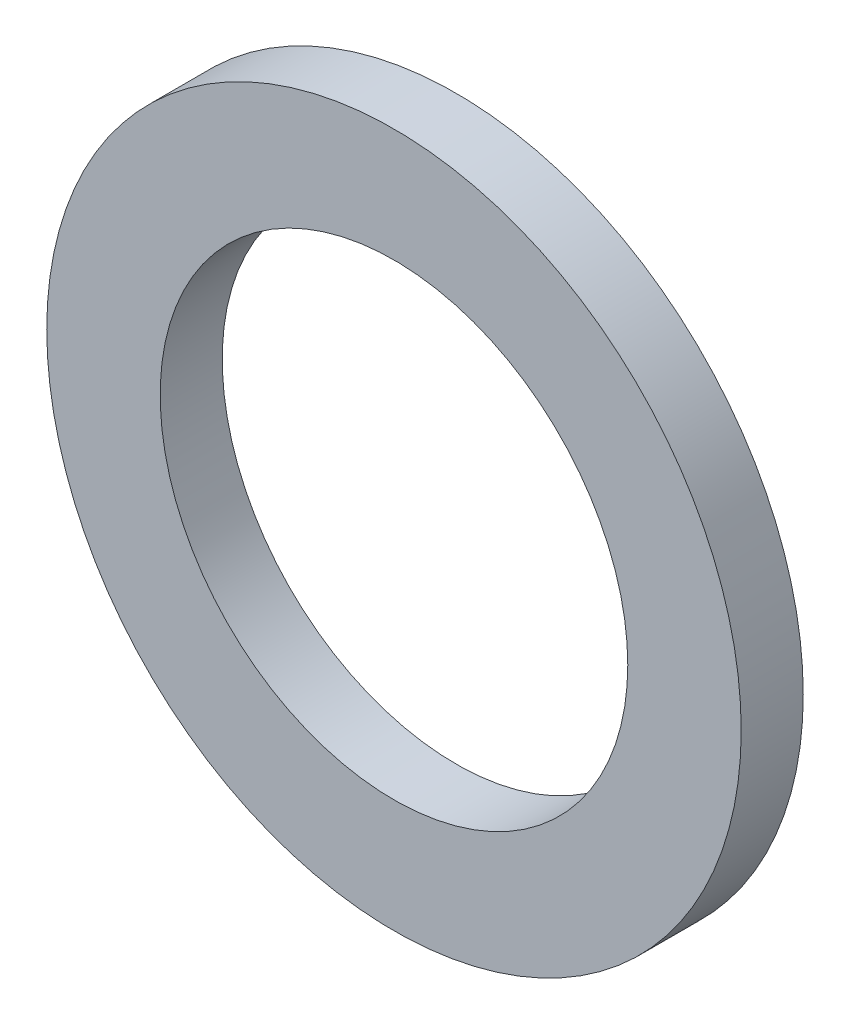
ISO-10303-21;
HEADER;
FILE_DESCRIPTION(('STEP AP214'),'2;1');
FILE_NAME('part.step','',(''),(''),'','','');
FILE_SCHEMA(('AUTOMOTIVE_DESIGN { 1 0 10303 214 1 1 1 1 }'));
ENDSEC;
DATA;
#1=APPLICATION_CONTEXT('core data for automotive mechanical design processes');
#2=APPLICATION_PROTOCOL_DEFINITION('international standard','automotive_design',2000,#1);
#3=PRODUCT_CONTEXT('',#1,'mechanical');
#4=PRODUCT('Part','Part','',(#3));
#5=PRODUCT_RELATED_PRODUCT_CATEGORY('part','',(#4));
#6=PRODUCT_DEFINITION_FORMATION('','',#4);
#7=PRODUCT_DEFINITION_CONTEXT('part definition',#1,'design');
#8=PRODUCT_DEFINITION('design','',#6,#7);
#9=PRODUCT_DEFINITION_SHAPE('','',#8);
#10=(LENGTH_UNIT() NAMED_UNIT(*) SI_UNIT(.MILLI.,.METRE.));
#11=(NAMED_UNIT(*) PLANE_ANGLE_UNIT() SI_UNIT($,.RADIAN.));
#12=(NAMED_UNIT(*) SI_UNIT($,.STERADIAN.) SOLID_ANGLE_UNIT());
#13=UNCERTAINTY_MEASURE_WITH_UNIT(LENGTH_MEASURE(1.E-05),#10,'distance_accuracy_value','');
#14=(GEOMETRIC_REPRESENTATION_CONTEXT(3) GLOBAL_UNCERTAINTY_ASSIGNED_CONTEXT((#13)) GLOBAL_UNIT_ASSIGNED_CONTEXT((#10,
#11,#12)) REPRESENTATION_CONTEXT('',''));
#15=CARTESIAN_POINT('',(0.,0.,0.));
#16=DIRECTION('',(0.,0.,1.));
#17=DIRECTION('',(1.,0.,0.));
#18=AXIS2_PLACEMENT_3D('',#15,#16,#17);
#19=CARTESIAN_POINT('',(0.,0.,0.850899999999998));
#20=DIRECTION('',(0.,0.,1.));
#21=DIRECTION('',(1.,0.,0.));
#22=AXIS2_PLACEMENT_3D('',#19,#20,#21);
#23=PLANE('',#22);
#24=CARTESIAN_POINT('',(0.,0.,0.850899999999998));
#25=DIRECTION('',(0.,0.,1.));
#26=DIRECTION('',(1.,0.,0.));
#27=AXIS2_PLACEMENT_3D('',#24,#25,#26);
#28=CIRCLE('',#27,9.525);
#29=CARTESIAN_POINT('',(9.525,0.,0.850899999999998));
#30=VERTEX_POINT('',#29);
#31=EDGE_CURVE('E10',#30,#30,#28,.T.);
#32=ORIENTED_EDGE('',*,*,#31,.T.);
#33=EDGE_LOOP('',(#32));
#34=FACE_BOUND('',#33,.T.);
#35=CARTESIAN_POINT('',(0.,0.,0.850899999999998));
#36=DIRECTION('',(0.,0.,1.));
#37=DIRECTION('',(1.,0.,0.));
#38=AXIS2_PLACEMENT_3D('',#35,#36,#37);
#39=CIRCLE('',#38,6.4135);
#40=CARTESIAN_POINT('',(6.4135,0.,0.850899999999998));
#41=VERTEX_POINT('',#40);
#42=EDGE_CURVE('E37',#41,#41,#39,.T.);
#43=ORIENTED_EDGE('',*,*,#42,.F.);
#44=EDGE_LOOP('',(#43));
#45=FACE_BOUND('',#44,.T.);
#46=ADVANCED_FACE('F30',(#34,#45),#23,.T.);
#47=CARTESIAN_POINT('',(0.,0.,0.850899999999998));
#48=DIRECTION('',(0.,0.,-1.));
#49=DIRECTION('',(-1.,0.,0.));
#50=AXIS2_PLACEMENT_3D('',#47,#48,#49);
#51=CYLINDRICAL_SURFACE('',#50,9.525);
#52=ORIENTED_EDGE('',*,*,#31,.F.);
#53=EDGE_LOOP('',(#52));
#54=FACE_BOUND('',#53,.T.);
#55=CARTESIAN_POINT('',(0.,0.,-0.850900000000002));
#56=DIRECTION('',(0.,0.,1.));
#57=DIRECTION('',(1.,0.,0.));
#58=AXIS2_PLACEMENT_3D('',#55,#56,#57);
#59=CIRCLE('',#58,9.525);
#60=CARTESIAN_POINT('',(9.525,0.,-0.850900000000002));
#61=VERTEX_POINT('',#60);
#62=EDGE_CURVE('E41',#61,#61,#59,.T.);
#63=ORIENTED_EDGE('',*,*,#62,.T.);
#64=EDGE_LOOP('',(#63));
#65=FACE_BOUND('',#64,.T.);
#66=ADVANCED_FACE('F32',(#54,#65),#51,.T.);
#67=CARTESIAN_POINT('',(0.,0.,0.850899999999998));
#68=DIRECTION('',(0.,0.,-1.));
#69=DIRECTION('',(-1.,0.,0.));
#70=AXIS2_PLACEMENT_3D('',#67,#68,#69);
#71=CYLINDRICAL_SURFACE('',#70,6.4135);
#72=ORIENTED_EDGE('',*,*,#42,.T.);
#73=EDGE_LOOP('',(#72));
#74=FACE_BOUND('',#73,.T.);
#75=CARTESIAN_POINT('',(0.,0.,-0.850900000000002));
#76=DIRECTION('',(0.,0.,1.));
#77=DIRECTION('',(1.,0.,0.));
#78=AXIS2_PLACEMENT_3D('',#75,#76,#77);
#79=CIRCLE('',#78,6.4135);
#80=CARTESIAN_POINT('',(6.4135,0.,-0.850900000000002));
#81=VERTEX_POINT('',#80);
#82=EDGE_CURVE('E45',#81,#81,#79,.T.);
#83=ORIENTED_EDGE('',*,*,#82,.F.);
#84=EDGE_LOOP('',(#83));
#85=FACE_BOUND('',#84,.T.);
#86=ADVANCED_FACE('F54',(#74,#85),#71,.F.);
#87=CARTESIAN_POINT('',(0.,0.,-0.850900000000002));
#88=DIRECTION('',(0.,0.,1.));
#89=DIRECTION('',(1.,0.,0.));
#90=AXIS2_PLACEMENT_3D('',#87,#88,#89);
#91=PLANE('',#90);
#92=ORIENTED_EDGE('',*,*,#82,.T.);
#93=EDGE_LOOP('',(#92));
#94=FACE_BOUND('',#93,.T.);
#95=ORIENTED_EDGE('',*,*,#62,.F.);
#96=EDGE_LOOP('',(#95));
#97=FACE_BOUND('',#96,.T.);
#98=ADVANCED_FACE('F51',(#94,#97),#91,.F.);
#99=CLOSED_SHELL('',(#46,#66,#86,#98));
#100=MANIFOLD_SOLID_BREP('B2',#99);
#101=ADVANCED_BREP_SHAPE_REPRESENTATION('',(#18,#100),#14);
#102=SHAPE_DEFINITION_REPRESENTATION(#9,#101);
ENDSEC;
END-ISO-10303-21;
